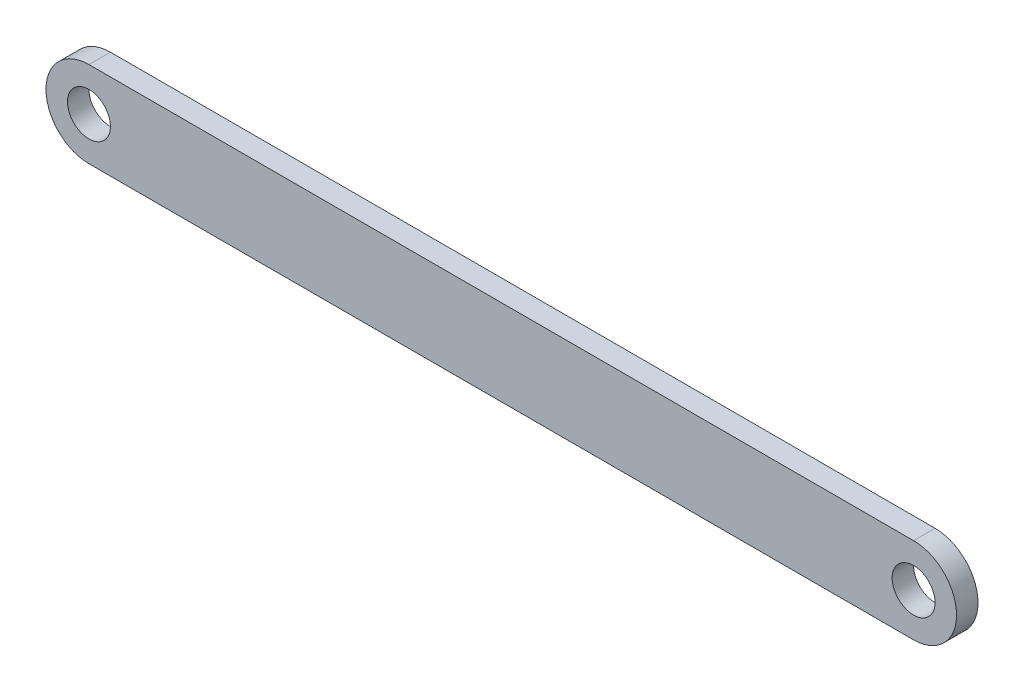
ISO-10303-21;
HEADER;
FILE_DESCRIPTION(('STEP AP214'),'2;1');
FILE_NAME('part.step','',(''),(''),'','','');
FILE_SCHEMA(('AUTOMOTIVE_DESIGN { 1 0 10303 214 1 1 1 1 }'));
ENDSEC;
DATA;
#1=APPLICATION_CONTEXT('core data for automotive mechanical design processes');
#2=APPLICATION_PROTOCOL_DEFINITION('international standard','automotive_design',2000,#1);
#3=PRODUCT_CONTEXT('',#1,'mechanical');
#4=PRODUCT('Part','Part','',(#3));
#5=PRODUCT_RELATED_PRODUCT_CATEGORY('part','',(#4));
#6=PRODUCT_DEFINITION_FORMATION('','',#4);
#7=PRODUCT_DEFINITION_CONTEXT('part definition',#1,'design');
#8=PRODUCT_DEFINITION('design','',#6,#7);
#9=PRODUCT_DEFINITION_SHAPE('','',#8);
#10=(LENGTH_UNIT() NAMED_UNIT(*) SI_UNIT(.MILLI.,.METRE.));
#11=(NAMED_UNIT(*) PLANE_ANGLE_UNIT() SI_UNIT($,.RADIAN.));
#12=(NAMED_UNIT(*) SI_UNIT($,.STERADIAN.) SOLID_ANGLE_UNIT());
#13=UNCERTAINTY_MEASURE_WITH_UNIT(LENGTH_MEASURE(1.E-05),#10,'distance_accuracy_value','');
#14=(GEOMETRIC_REPRESENTATION_CONTEXT(3) GLOBAL_UNCERTAINTY_ASSIGNED_CONTEXT((#13)) GLOBAL_UNIT_ASSIGNED_CONTEXT((#10,
#11,#12)) REPRESENTATION_CONTEXT('',''));
#15=CARTESIAN_POINT('',(0.,0.,0.));
#16=DIRECTION('',(0.,0.,1.));
#17=DIRECTION('',(1.,0.,0.));
#18=AXIS2_PLACEMENT_3D('',#15,#16,#17);
#19=CARTESIAN_POINT('',(-609.6,0.157439451623581,15.875));
#20=DIRECTION('',(0.,0.,1.));
#21=DIRECTION('',(1.,0.,0.));
#22=AXIS2_PLACEMENT_3D('',#19,#20,#21);
#23=PLANE('',#22);
#24=CARTESIAN_POINT('',(-609.6,0.157439451623581,15.875));
#25=DIRECTION('',(0.,0.,1.));
#26=DIRECTION('',(1.,0.,0.));
#27=AXIS2_PLACEMENT_3D('',#24,#25,#26);
#28=CIRCLE('',#27,31.75);
#29=CARTESIAN_POINT('',(-577.85,0.157439451623581,15.875));
#30=VERTEX_POINT('',#29);
#31=EDGE_CURVE('E104',#30,#30,#28,.T.);
#32=ORIENTED_EDGE('',*,*,#31,.F.);
#33=EDGE_LOOP('',(#32));
#34=FACE_BOUND('',#33,.T.);
#35=CARTESIAN_POINT('',(-609.6,0.157439451623581,15.875));
#36=DIRECTION('',(0.,0.,1.));
#37=DIRECTION('',(1.,0.,0.));
#38=AXIS2_PLACEMENT_3D('',#35,#36,#37);
#39=CIRCLE('',#38,63.5);
#40=CARTESIAN_POINT('',(-609.6,63.6574394516236,15.875));
#41=VERTEX_POINT('',#40);
#42=CARTESIAN_POINT('',(-609.6,-63.3425605483764,15.875));
#43=VERTEX_POINT('',#42);
#44=EDGE_CURVE('E89',#41,#43,#39,.T.);
#45=ORIENTED_EDGE('',*,*,#44,.T.);
#46=DIRECTION('',(1.,0.,0.));
#47=VECTOR('',#46,1.);
#48=CARTESIAN_POINT('',(-609.6,-63.3425605483764,15.875));
#49=LINE('',#48,#47);
#50=CARTESIAN_POINT('',(609.6,-63.3425605483764,15.875));
#51=VERTEX_POINT('',#50);
#52=EDGE_CURVE('E84',#43,#51,#49,.T.);
#53=ORIENTED_EDGE('',*,*,#52,.T.);
#54=CARTESIAN_POINT('',(609.6,0.157439451623581,15.875));
#55=DIRECTION('',(0.,0.,1.));
#56=DIRECTION('',(1.,0.,0.));
#57=AXIS2_PLACEMENT_3D('',#54,#55,#56);
#58=CIRCLE('',#57,63.5);
#59=CARTESIAN_POINT('',(609.6,63.6574394516236,15.875));
#60=VERTEX_POINT('',#59);
#61=EDGE_CURVE('E87',#51,#60,#58,.T.);
#62=ORIENTED_EDGE('',*,*,#61,.T.);
#63=DIRECTION('',(-1.,0.,0.));
#64=VECTOR('',#63,1.);
#65=CARTESIAN_POINT('',(-609.6,63.6574394516236,15.875));
#66=LINE('',#65,#64);
#67=EDGE_CURVE('E54',#60,#41,#66,.T.);
#68=ORIENTED_EDGE('',*,*,#67,.T.);
#69=EDGE_LOOP('',(#45,#53,#62,#68));
#70=FACE_BOUND('',#69,.T.);
#71=CARTESIAN_POINT('',(609.6,0.157439451623581,15.875));
#72=DIRECTION('',(0.,0.,1.));
#73=DIRECTION('',(1.,0.,0.));
#74=AXIS2_PLACEMENT_3D('',#71,#72,#73);
#75=CIRCLE('',#74,31.75);
#76=CARTESIAN_POINT('',(641.35,0.157439451623581,15.875));
#77=VERTEX_POINT('',#76);
#78=EDGE_CURVE('E119',#77,#77,#75,.T.);
#79=ORIENTED_EDGE('',*,*,#78,.F.);
#80=EDGE_LOOP('',(#79));
#81=FACE_BOUND('',#80,.T.);
#82=ADVANCED_FACE('F37',(#34,#70,#81),#23,.T.);
#83=CARTESIAN_POINT('',(-609.6,0.157439451623581,-15.875));
#84=DIRECTION('',(0.,0.,1.));
#85=DIRECTION('',(1.,0.,0.));
#86=AXIS2_PLACEMENT_3D('',#83,#84,#85);
#87=PLANE('',#86);
#88=CARTESIAN_POINT('',(-609.6,0.157439451623581,-15.875));
#89=DIRECTION('',(0.,0.,1.));
#90=DIRECTION('',(1.,0.,0.));
#91=AXIS2_PLACEMENT_3D('',#88,#89,#90);
#92=CIRCLE('',#91,31.75);
#93=CARTESIAN_POINT('',(-577.85,0.157439451623581,-15.875));
#94=VERTEX_POINT('',#93);
#95=EDGE_CURVE('E116',#94,#94,#92,.T.);
#96=ORIENTED_EDGE('',*,*,#95,.T.);
#97=EDGE_LOOP('',(#96));
#98=FACE_BOUND('',#97,.T.);
#99=CARTESIAN_POINT('',(-609.6,0.157439451623581,-15.875));
#100=DIRECTION('',(0.,0.,1.));
#101=DIRECTION('',(1.,0.,0.));
#102=AXIS2_PLACEMENT_3D('',#99,#100,#101);
#103=CIRCLE('',#102,63.5);
#104=CARTESIAN_POINT('',(-609.6,63.6574394516236,-15.875));
#105=VERTEX_POINT('',#104);
#106=CARTESIAN_POINT('',(-609.6,-63.3425605483764,-15.875));
#107=VERTEX_POINT('',#106);
#108=EDGE_CURVE('E101',#105,#107,#103,.T.);
#109=ORIENTED_EDGE('',*,*,#108,.F.);
#110=DIRECTION('',(-1.,0.,0.));
#111=VECTOR('',#110,1.);
#112=CARTESIAN_POINT('',(-609.6,63.6574394516236,-15.875));
#113=LINE('',#112,#111);
#114=CARTESIAN_POINT('',(609.6,63.6574394516236,-15.875));
#115=VERTEX_POINT('',#114);
#116=EDGE_CURVE('E77',#115,#105,#113,.T.);
#117=ORIENTED_EDGE('',*,*,#116,.F.);
#118=CARTESIAN_POINT('',(609.6,0.157439451623581,-15.875));
#119=DIRECTION('',(0.,0.,1.));
#120=DIRECTION('',(1.,0.,0.));
#121=AXIS2_PLACEMENT_3D('',#118,#119,#120);
#122=CIRCLE('',#121,63.5);
#123=CARTESIAN_POINT('',(609.6,-63.3425605483764,-15.875));
#124=VERTEX_POINT('',#123);
#125=EDGE_CURVE('E71',#124,#115,#122,.T.);
#126=ORIENTED_EDGE('',*,*,#125,.F.);
#127=DIRECTION('',(1.,0.,0.));
#128=VECTOR('',#127,1.);
#129=CARTESIAN_POINT('',(-609.6,-63.3425605483764,-15.875));
#130=LINE('',#129,#128);
#131=EDGE_CURVE('E93',#107,#124,#130,.T.);
#132=ORIENTED_EDGE('',*,*,#131,.F.);
#133=EDGE_LOOP('',(#109,#117,#126,#132));
#134=FACE_BOUND('',#133,.T.);
#135=CARTESIAN_POINT('',(609.6,0.157439451623581,-15.875));
#136=DIRECTION('',(0.,0.,1.));
#137=DIRECTION('',(1.,0.,0.));
#138=AXIS2_PLACEMENT_3D('',#135,#136,#137);
#139=CIRCLE('',#138,31.75);
#140=CARTESIAN_POINT('',(641.35,0.157439451623581,-15.875));
#141=VERTEX_POINT('',#140);
#142=EDGE_CURVE('E122',#141,#141,#139,.T.);
#143=ORIENTED_EDGE('',*,*,#142,.T.);
#144=EDGE_LOOP('',(#143));
#145=FACE_BOUND('',#144,.T.);
#146=ADVANCED_FACE('F112',(#98,#134,#145),#87,.F.);
#147=CARTESIAN_POINT('',(-609.6,0.157439451623581,15.875));
#148=DIRECTION('',(0.,0.,-1.));
#149=DIRECTION('',(-1.,0.,0.));
#150=AXIS2_PLACEMENT_3D('',#147,#148,#149);
#151=CYLINDRICAL_SURFACE('',#150,63.5);
#152=ORIENTED_EDGE('',*,*,#108,.T.);
#153=DIRECTION('',(0.,0.,-1.));
#154=VECTOR('',#153,1.);
#155=CARTESIAN_POINT('',(-609.6,-63.3425605483764,15.875));
#156=LINE('',#155,#154);
#157=EDGE_CURVE('E11',#43,#107,#156,.T.);
#158=ORIENTED_EDGE('',*,*,#157,.F.);
#159=ORIENTED_EDGE('',*,*,#44,.F.);
#160=DIRECTION('',(0.,0.,-1.));
#161=VECTOR('',#160,1.);
#162=CARTESIAN_POINT('',(-609.6,63.6574394516236,15.875));
#163=LINE('',#162,#161);
#164=EDGE_CURVE('E97',#41,#105,#163,.T.);
#165=ORIENTED_EDGE('',*,*,#164,.T.);
#166=EDGE_LOOP('',(#152,#158,#159,#165));
#167=FACE_BOUND('',#166,.T.);
#168=ADVANCED_FACE('F39',(#167),#151,.T.);
#169=CARTESIAN_POINT('',(-609.6,-63.3425605483764,15.875));
#170=DIRECTION('',(0.,1.,0.));
#171=DIRECTION('',(0.,0.,1.));
#172=AXIS2_PLACEMENT_3D('',#169,#170,#171);
#173=PLANE('',#172);
#174=ORIENTED_EDGE('',*,*,#131,.T.);
#175=DIRECTION('',(0.,0.,-1.));
#176=VECTOR('',#175,1.);
#177=CARTESIAN_POINT('',(609.6,-63.3425605483764,15.875));
#178=LINE('',#177,#176);
#179=EDGE_CURVE('E46',#51,#124,#178,.T.);
#180=ORIENTED_EDGE('',*,*,#179,.F.);
#181=ORIENTED_EDGE('',*,*,#52,.F.);
#182=ORIENTED_EDGE('',*,*,#157,.T.);
#183=EDGE_LOOP('',(#174,#180,#181,#182));
#184=FACE_BOUND('',#183,.T.);
#185=ADVANCED_FACE('F92',(#184),#173,.F.);
#186=CARTESIAN_POINT('',(609.6,0.157439451623581,15.875));
#187=DIRECTION('',(0.,0.,-1.));
#188=DIRECTION('',(-1.,0.,0.));
#189=AXIS2_PLACEMENT_3D('',#186,#187,#188);
#190=CYLINDRICAL_SURFACE('',#189,63.5);
#191=ORIENTED_EDGE('',*,*,#125,.T.);
#192=DIRECTION('',(0.,0.,-1.));
#193=VECTOR('',#192,1.);
#194=CARTESIAN_POINT('',(609.6,63.6574394516236,15.875));
#195=LINE('',#194,#193);
#196=EDGE_CURVE('E94',#60,#115,#195,.T.);
#197=ORIENTED_EDGE('',*,*,#196,.F.);
#198=ORIENTED_EDGE('',*,*,#61,.F.);
#199=ORIENTED_EDGE('',*,*,#179,.T.);
#200=EDGE_LOOP('',(#191,#197,#198,#199));
#201=FACE_BOUND('',#200,.T.);
#202=ADVANCED_FACE('F95',(#201),#190,.T.);
#203=CARTESIAN_POINT('',(-609.6,63.6574394516236,15.875));
#204=DIRECTION('',(0.,-1.,0.));
#205=DIRECTION('',(0.,0.,-1.));
#206=AXIS2_PLACEMENT_3D('',#203,#204,#205);
#207=PLANE('',#206);
#208=ORIENTED_EDGE('',*,*,#116,.T.);
#209=ORIENTED_EDGE('',*,*,#164,.F.);
#210=ORIENTED_EDGE('',*,*,#67,.F.);
#211=ORIENTED_EDGE('',*,*,#196,.T.);
#212=EDGE_LOOP('',(#208,#209,#210,#211));
#213=FACE_BOUND('',#212,.T.);
#214=ADVANCED_FACE('F109',(#213),#207,.F.);
#215=CARTESIAN_POINT('',(-609.6,0.157439451623581,15.875));
#216=DIRECTION('',(0.,0.,-1.));
#217=DIRECTION('',(-1.,0.,0.));
#218=AXIS2_PLACEMENT_3D('',#215,#216,#217);
#219=CYLINDRICAL_SURFACE('',#218,31.75);
#220=ORIENTED_EDGE('',*,*,#31,.T.);
#221=EDGE_LOOP('',(#220));
#222=FACE_BOUND('',#221,.T.);
#223=ORIENTED_EDGE('',*,*,#95,.F.);
#224=EDGE_LOOP('',(#223));
#225=FACE_BOUND('',#224,.T.);
#226=ADVANCED_FACE('F140',(#222,#225),#219,.F.);
#227=CARTESIAN_POINT('',(609.6,0.157439451623581,15.875));
#228=DIRECTION('',(0.,0.,-1.));
#229=DIRECTION('',(-1.,0.,0.));
#230=AXIS2_PLACEMENT_3D('',#227,#228,#229);
#231=CYLINDRICAL_SURFACE('',#230,31.75);
#232=ORIENTED_EDGE('',*,*,#78,.T.);
#233=EDGE_LOOP('',(#232));
#234=FACE_BOUND('',#233,.T.);
#235=ORIENTED_EDGE('',*,*,#142,.F.);
#236=EDGE_LOOP('',(#235));
#237=FACE_BOUND('',#236,.T.);
#238=ADVANCED_FACE('F128',(#234,#237),#231,.F.);
#239=CLOSED_SHELL('',(#82,#146,#168,#185,#202,#214,#226,#238));
#240=MANIFOLD_SOLID_BREP('B2',#239);
#241=ADVANCED_BREP_SHAPE_REPRESENTATION('',(#18,#240),#14);
#242=SHAPE_DEFINITION_REPRESENTATION(#9,#241);
ENDSEC;
END-ISO-10303-21;
